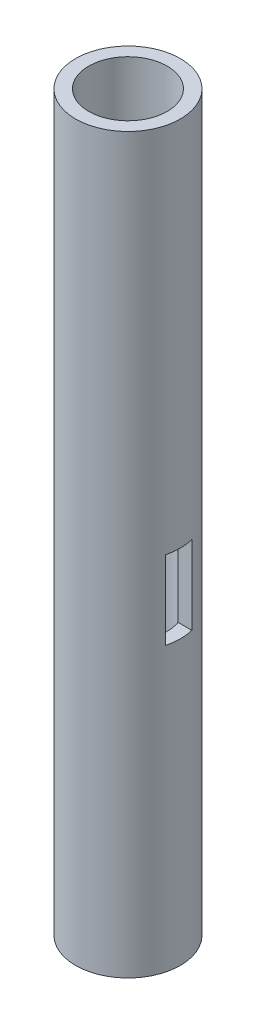
ISO-10303-21;
HEADER;
FILE_DESCRIPTION(('STEP AP214'),'2;1');
FILE_NAME('part.step','',(''),(''),'','','');
FILE_SCHEMA(('AUTOMOTIVE_DESIGN { 1 0 10303 214 1 1 1 1 }'));
ENDSEC;
DATA;
#1=APPLICATION_CONTEXT('core data for automotive mechanical design processes');
#2=APPLICATION_PROTOCOL_DEFINITION('international standard','automotive_design',2000,#1);
#3=PRODUCT_CONTEXT('',#1,'mechanical');
#4=PRODUCT('Part','Part','',(#3));
#5=PRODUCT_RELATED_PRODUCT_CATEGORY('part','',(#4));
#6=PRODUCT_DEFINITION_FORMATION('','',#4);
#7=PRODUCT_DEFINITION_CONTEXT('part definition',#1,'design');
#8=PRODUCT_DEFINITION('design','',#6,#7);
#9=PRODUCT_DEFINITION_SHAPE('','',#8);
#10=(LENGTH_UNIT() NAMED_UNIT(*) SI_UNIT(.MILLI.,.METRE.));
#11=(NAMED_UNIT(*) PLANE_ANGLE_UNIT() SI_UNIT($,.RADIAN.));
#12=(NAMED_UNIT(*) SI_UNIT($,.STERADIAN.) SOLID_ANGLE_UNIT());
#13=UNCERTAINTY_MEASURE_WITH_UNIT(LENGTH_MEASURE(1.E-05),#10,'distance_accuracy_value','');
#14=(GEOMETRIC_REPRESENTATION_CONTEXT(3) GLOBAL_UNCERTAINTY_ASSIGNED_CONTEXT((#13)) GLOBAL_UNIT_ASSIGNED_CONTEXT((#10,
#11,#12)) REPRESENTATION_CONTEXT('',''));
#15=CARTESIAN_POINT('',(0.,0.,0.));
#16=DIRECTION('',(0.,0.,1.));
#17=DIRECTION('',(1.,0.,0.));
#18=AXIS2_PLACEMENT_3D('',#15,#16,#17);
#19=CARTESIAN_POINT('',(0.,177.8,0.));
#20=DIRECTION('',(0.,1.,0.));
#21=DIRECTION('',(0.,0.,1.));
#22=AXIS2_PLACEMENT_3D('',#19,#20,#21);
#23=PLANE('',#22);
#24=CARTESIAN_POINT('',(0.,177.8,0.));
#25=DIRECTION('',(0.,1.,0.));
#26=DIRECTION('',(0.,0.,1.));
#27=AXIS2_PLACEMENT_3D('',#24,#25,#26);
#28=CIRCLE('',#27,12.7);
#29=CARTESIAN_POINT('',(0.,177.8,12.7));
#30=VERTEX_POINT('',#29);
#31=EDGE_CURVE('E119',#30,#30,#28,.T.);
#32=ORIENTED_EDGE('',*,*,#31,.T.);
#33=EDGE_LOOP('',(#32));
#34=FACE_BOUND('',#33,.T.);
#35=CARTESIAN_POINT('',(0.,177.8,0.));
#36=DIRECTION('',(0.,1.,0.));
#37=DIRECTION('',(0.,0.,1.));
#38=AXIS2_PLACEMENT_3D('',#35,#36,#37);
#39=CIRCLE('',#38,9.525);
#40=CARTESIAN_POINT('',(0.,177.8,9.525));
#41=VERTEX_POINT('',#40);
#42=EDGE_CURVE('E198',#41,#41,#39,.T.);
#43=ORIENTED_EDGE('',*,*,#42,.F.);
#44=EDGE_LOOP('',(#43));
#45=FACE_BOUND('',#44,.T.);
#46=ADVANCED_FACE('F40',(#34,#45),#23,.T.);
#47=CARTESIAN_POINT('',(0.,0.,0.));
#48=DIRECTION('',(0.,1.,0.));
#49=DIRECTION('',(0.,0.,1.));
#50=AXIS2_PLACEMENT_3D('',#47,#48,#49);
#51=PLANE('',#50);
#52=CARTESIAN_POINT('',(0.,0.,0.));
#53=DIRECTION('',(0.,1.,0.));
#54=DIRECTION('',(0.,0.,1.));
#55=AXIS2_PLACEMENT_3D('',#52,#53,#54);
#56=CIRCLE('',#55,12.7);
#57=CARTESIAN_POINT('',(0.,0.,12.7));
#58=VERTEX_POINT('',#57);
#59=EDGE_CURVE('E202',#58,#58,#56,.T.);
#60=ORIENTED_EDGE('',*,*,#59,.F.);
#61=EDGE_LOOP('',(#60));
#62=FACE_BOUND('',#61,.T.);
#63=CARTESIAN_POINT('',(0.,0.,0.));
#64=DIRECTION('',(0.,1.,0.));
#65=DIRECTION('',(0.,0.,1.));
#66=AXIS2_PLACEMENT_3D('',#63,#64,#65);
#67=CIRCLE('',#66,9.525);
#68=CARTESIAN_POINT('',(0.,0.,9.525));
#69=VERTEX_POINT('',#68);
#70=EDGE_CURVE('E197',#69,#69,#67,.T.);
#71=ORIENTED_EDGE('',*,*,#70,.T.);
#72=EDGE_LOOP('',(#71));
#73=FACE_BOUND('',#72,.T.);
#74=ADVANCED_FACE('F213',(#62,#73),#51,.F.);
#75=CARTESIAN_POINT('',(0.,177.8,0.));
#76=DIRECTION('',(0.,-1.,0.));
#77=DIRECTION('',(0.,0.,-1.));
#78=AXIS2_PLACEMENT_3D('',#75,#76,#77);
#79=CYLINDRICAL_SURFACE('',#78,12.7);
#80=DIRECTION('',(0.,-1.,0.));
#81=VECTOR('',#80,1.);
#82=CARTESIAN_POINT('',(-12.2967221242085,177.8,3.17500000000001));
#83=LINE('',#82,#81);
#84=CARTESIAN_POINT('',(-12.2967221242085,87.67064,3.17500000000001));
#85=VERTEX_POINT('',#84);
#86=CARTESIAN_POINT('',(-12.2967221242085,68.62064,3.17500000000001));
#87=VERTEX_POINT('',#86);
#88=EDGE_CURVE('E194',#85,#87,#83,.T.);
#89=ORIENTED_EDGE('',*,*,#88,.T.);
#90=CARTESIAN_POINT('',(0.,68.62064,0.));
#91=DIRECTION('',(0.,-1.,0.));
#92=DIRECTION('',(0.,0.,-1.));
#93=AXIS2_PLACEMENT_3D('',#90,#91,#92);
#94=CIRCLE('',#93,12.7);
#95=CARTESIAN_POINT('',(-12.2967221242086,68.62064,-3.17499999999999));
#96=VERTEX_POINT('',#95);
#97=EDGE_CURVE('E56',#87,#96,#94,.T.);
#98=ORIENTED_EDGE('',*,*,#97,.T.);
#99=DIRECTION('',(0.,-1.,0.));
#100=VECTOR('',#99,1.);
#101=CARTESIAN_POINT('',(-12.2967221242086,177.8,-3.17499999999999));
#102=LINE('',#101,#100);
#103=CARTESIAN_POINT('',(-12.2967221242086,87.67064,-3.17499999999999));
#104=VERTEX_POINT('',#103);
#105=EDGE_CURVE('E126',#96,#104,#102,.F.);
#106=ORIENTED_EDGE('',*,*,#105,.T.);
#107=CARTESIAN_POINT('',(0.,87.67064,0.));
#108=DIRECTION('',(0.,1.,0.));
#109=DIRECTION('',(0.,0.,1.));
#110=AXIS2_PLACEMENT_3D('',#107,#108,#109);
#111=CIRCLE('',#110,12.7);
#112=EDGE_CURVE('E188',#104,#85,#111,.T.);
#113=ORIENTED_EDGE('',*,*,#112,.T.);
#114=EDGE_LOOP('',(#89,#98,#106,#113));
#115=FACE_BOUND('',#114,.T.);
#116=DIRECTION('',(0.,-1.,0.));
#117=VECTOR('',#116,1.);
#118=CARTESIAN_POINT('',(12.2967221242086,177.8,-3.17499999999999));
#119=LINE('',#118,#117);
#120=CARTESIAN_POINT('',(12.2967221242086,87.67064,-3.17499999999999));
#121=VERTEX_POINT('',#120);
#122=CARTESIAN_POINT('',(12.2967221242086,68.62064,-3.17499999999999));
#123=VERTEX_POINT('',#122);
#124=EDGE_CURVE('E174',#121,#123,#119,.T.);
#125=ORIENTED_EDGE('',*,*,#124,.T.);
#126=CARTESIAN_POINT('',(12.2967221242085,68.62064,3.17500000000001));
#127=VERTEX_POINT('',#126);
#128=EDGE_CURVE('E64',#123,#127,#94,.T.);
#129=ORIENTED_EDGE('',*,*,#128,.T.);
#130=DIRECTION('',(0.,-1.,0.));
#131=VECTOR('',#130,1.);
#132=CARTESIAN_POINT('',(12.2967221242085,177.8,3.17500000000001));
#133=LINE('',#132,#131);
#134=CARTESIAN_POINT('',(12.2967221242085,87.67064,3.17500000000001));
#135=VERTEX_POINT('',#134);
#136=EDGE_CURVE('E164',#127,#135,#133,.F.);
#137=ORIENTED_EDGE('',*,*,#136,.T.);
#138=EDGE_CURVE('E189',#135,#121,#111,.T.);
#139=ORIENTED_EDGE('',*,*,#138,.T.);
#140=EDGE_LOOP('',(#125,#129,#137,#139));
#141=FACE_BOUND('',#140,.T.);
#142=ORIENTED_EDGE('',*,*,#31,.F.);
#143=EDGE_LOOP('',(#142));
#144=FACE_BOUND('',#143,.T.);
#145=ORIENTED_EDGE('',*,*,#59,.T.);
#146=EDGE_LOOP('',(#145));
#147=FACE_BOUND('',#146,.T.);
#148=ADVANCED_FACE('F42',(#115,#141,#144,#147),#79,.T.);
#149=CARTESIAN_POINT('',(0.,177.8,0.));
#150=DIRECTION('',(0.,-1.,0.));
#151=DIRECTION('',(0.,0.,-1.));
#152=AXIS2_PLACEMENT_3D('',#149,#150,#151);
#153=CYLINDRICAL_SURFACE('',#152,9.525);
#154=DIRECTION('',(0.,-1.,0.));
#155=VECTOR('',#154,1.);
#156=CARTESIAN_POINT('',(8.98025612106915,177.8,3.17500000000001));
#157=LINE('',#156,#155);
#158=CARTESIAN_POINT('',(8.98025612106915,68.62064,3.17500000000001));
#159=VERTEX_POINT('',#158);
#160=CARTESIAN_POINT('',(8.98025612106915,87.67064,3.17500000000001));
#161=VERTEX_POINT('',#160);
#162=EDGE_CURVE('E11',#159,#161,#157,.F.);
#163=ORIENTED_EDGE('',*,*,#162,.F.);
#164=CARTESIAN_POINT('',(0.,68.62064,0.));
#165=DIRECTION('',(0.,-1.,0.));
#166=DIRECTION('',(0.,0.,-1.));
#167=AXIS2_PLACEMENT_3D('',#164,#165,#166);
#168=CIRCLE('',#167,9.525);
#169=CARTESIAN_POINT('',(8.98025612106916,68.62064,-3.17499999999999));
#170=VERTEX_POINT('',#169);
#171=EDGE_CURVE('E121',#170,#159,#168,.T.);
#172=ORIENTED_EDGE('',*,*,#171,.F.);
#173=DIRECTION('',(0.,-1.,0.));
#174=VECTOR('',#173,1.);
#175=CARTESIAN_POINT('',(8.98025612106916,177.8,-3.17499999999999));
#176=LINE('',#175,#174);
#177=CARTESIAN_POINT('',(8.98025612106916,87.67064,-3.17499999999999));
#178=VERTEX_POINT('',#177);
#179=EDGE_CURVE('E143',#178,#170,#176,.T.);
#180=ORIENTED_EDGE('',*,*,#179,.F.);
#181=CARTESIAN_POINT('',(0.,87.67064,0.));
#182=DIRECTION('',(0.,1.,0.));
#183=DIRECTION('',(0.,0.,1.));
#184=AXIS2_PLACEMENT_3D('',#181,#182,#183);
#185=CIRCLE('',#184,9.525);
#186=EDGE_CURVE('E49',#161,#178,#185,.T.);
#187=ORIENTED_EDGE('',*,*,#186,.F.);
#188=EDGE_LOOP('',(#163,#172,#180,#187));
#189=FACE_BOUND('',#188,.T.);
#190=DIRECTION('',(0.,-1.,0.));
#191=VECTOR('',#190,1.);
#192=CARTESIAN_POINT('',(-8.98025612106915,177.8,3.17500000000001));
#193=LINE('',#192,#191);
#194=CARTESIAN_POINT('',(-8.98025612106915,87.67064,3.17500000000001));
#195=VERTEX_POINT('',#194);
#196=CARTESIAN_POINT('',(-8.98025612106915,68.62064,3.17500000000001));
#197=VERTEX_POINT('',#196);
#198=EDGE_CURVE('E138',#195,#197,#193,.T.);
#199=ORIENTED_EDGE('',*,*,#198,.F.);
#200=CARTESIAN_POINT('',(-8.98025612106916,87.67064,-3.17499999999999));
#201=VERTEX_POINT('',#200);
#202=EDGE_CURVE('E134',#201,#195,#185,.T.);
#203=ORIENTED_EDGE('',*,*,#202,.F.);
#204=DIRECTION('',(0.,-1.,0.));
#205=VECTOR('',#204,1.);
#206=CARTESIAN_POINT('',(-8.98025612106916,177.8,-3.17499999999999));
#207=LINE('',#206,#205);
#208=CARTESIAN_POINT('',(-8.98025612106916,68.62064,-3.17499999999999));
#209=VERTEX_POINT('',#208);
#210=EDGE_CURVE('E118',#209,#201,#207,.F.);
#211=ORIENTED_EDGE('',*,*,#210,.F.);
#212=EDGE_CURVE('E106',#197,#209,#168,.T.);
#213=ORIENTED_EDGE('',*,*,#212,.F.);
#214=EDGE_LOOP('',(#199,#203,#211,#213));
#215=FACE_BOUND('',#214,.T.);
#216=ORIENTED_EDGE('',*,*,#42,.T.);
#217=EDGE_LOOP('',(#216));
#218=FACE_BOUND('',#217,.T.);
#219=ORIENTED_EDGE('',*,*,#70,.F.);
#220=EDGE_LOOP('',(#219));
#221=FACE_BOUND('',#220,.T.);
#222=ADVANCED_FACE('F132',(#189,#215,#218,#221),#153,.F.);
#223=CARTESIAN_POINT('',(-12.7,68.62064,3.17500000000001));
#224=DIRECTION('',(0.,-1.,0.));
#225=DIRECTION('',(0.,0.,-1.));
#226=AXIS2_PLACEMENT_3D('',#223,#224,#225);
#227=PLANE('',#226);
#228=DIRECTION('',(1.,0.,0.));
#229=VECTOR('',#228,1.);
#230=CARTESIAN_POINT('',(-12.7,68.62064,3.17500000000001));
#231=LINE('',#230,#229);
#232=EDGE_CURVE('E112',#87,#197,#231,.T.);
#233=ORIENTED_EDGE('',*,*,#232,.T.);
#234=ORIENTED_EDGE('',*,*,#212,.T.);
#235=DIRECTION('',(1.,0.,0.));
#236=VECTOR('',#235,1.);
#237=CARTESIAN_POINT('',(-12.7,68.62064,-3.17499999999999));
#238=LINE('',#237,#236);
#239=EDGE_CURVE('E109',#96,#209,#238,.T.);
#240=ORIENTED_EDGE('',*,*,#239,.F.);
#241=ORIENTED_EDGE('',*,*,#97,.F.);
#242=EDGE_LOOP('',(#233,#234,#240,#241));
#243=FACE_BOUND('',#242,.T.);
#244=ADVANCED_FACE('F108',(#243),#227,.F.);
#245=CARTESIAN_POINT('',(-12.7,68.62064,-3.17499999999999));
#246=DIRECTION('',(0.,0.,-1.));
#247=DIRECTION('',(-1.,0.,0.));
#248=AXIS2_PLACEMENT_3D('',#245,#246,#247);
#249=PLANE('',#248);
#250=ORIENTED_EDGE('',*,*,#239,.T.);
#251=ORIENTED_EDGE('',*,*,#210,.T.);
#252=DIRECTION('',(1.,0.,0.));
#253=VECTOR('',#252,1.);
#254=CARTESIAN_POINT('',(-12.7,87.67064,-3.17499999999999));
#255=LINE('',#254,#253);
#256=EDGE_CURVE('E176',#104,#201,#255,.T.);
#257=ORIENTED_EDGE('',*,*,#256,.F.);
#258=ORIENTED_EDGE('',*,*,#105,.F.);
#259=EDGE_LOOP('',(#250,#251,#257,#258));
#260=FACE_BOUND('',#259,.T.);
#261=ADVANCED_FACE('F123',(#260),#249,.F.);
#262=CARTESIAN_POINT('',(-12.7,87.67064,3.17500000000001));
#263=DIRECTION('',(0.,1.,0.));
#264=DIRECTION('',(0.,0.,1.));
#265=AXIS2_PLACEMENT_3D('',#262,#263,#264);
#266=PLANE('',#265);
#267=ORIENTED_EDGE('',*,*,#256,.T.);
#268=ORIENTED_EDGE('',*,*,#202,.T.);
#269=DIRECTION('',(1.,0.,0.));
#270=VECTOR('',#269,1.);
#271=CARTESIAN_POINT('',(-12.7,87.67064,3.17500000000001));
#272=LINE('',#271,#270);
#273=EDGE_CURVE('E319',#85,#195,#272,.T.);
#274=ORIENTED_EDGE('',*,*,#273,.F.);
#275=ORIENTED_EDGE('',*,*,#112,.F.);
#276=EDGE_LOOP('',(#267,#268,#274,#275));
#277=FACE_BOUND('',#276,.T.);
#278=ADVANCED_FACE('F263',(#277),#266,.F.);
#279=CARTESIAN_POINT('',(-12.7,68.62064,3.17500000000001));
#280=DIRECTION('',(0.,0.,1.));
#281=DIRECTION('',(1.,0.,0.));
#282=AXIS2_PLACEMENT_3D('',#279,#280,#281);
#283=PLANE('',#282);
#284=ORIENTED_EDGE('',*,*,#273,.T.);
#285=ORIENTED_EDGE('',*,*,#198,.T.);
#286=ORIENTED_EDGE('',*,*,#232,.F.);
#287=ORIENTED_EDGE('',*,*,#88,.F.);
#288=EDGE_LOOP('',(#284,#285,#286,#287));
#289=FACE_BOUND('',#288,.T.);
#290=ADVANCED_FACE('F270',(#289),#283,.F.);
#291=EDGE_CURVE('E156',#159,#127,#231,.T.);
#292=ORIENTED_EDGE('',*,*,#291,.F.);
#293=ORIENTED_EDGE('',*,*,#162,.T.);
#294=EDGE_CURVE('E171',#161,#135,#272,.T.);
#295=ORIENTED_EDGE('',*,*,#294,.T.);
#296=ORIENTED_EDGE('',*,*,#136,.F.);
#297=EDGE_LOOP('',(#292,#293,#295,#296));
#298=FACE_BOUND('',#297,.T.);
#299=ADVANCED_FACE('F161',(#298),#283,.F.);
#300=ORIENTED_EDGE('',*,*,#294,.F.);
#301=ORIENTED_EDGE('',*,*,#186,.T.);
#302=EDGE_CURVE('E128',#178,#121,#255,.T.);
#303=ORIENTED_EDGE('',*,*,#302,.T.);
#304=ORIENTED_EDGE('',*,*,#138,.F.);
#305=EDGE_LOOP('',(#300,#301,#303,#304));
#306=FACE_BOUND('',#305,.T.);
#307=ADVANCED_FACE('F170',(#306),#266,.F.);
#308=ORIENTED_EDGE('',*,*,#302,.F.);
#309=ORIENTED_EDGE('',*,*,#179,.T.);
#310=EDGE_CURVE('E129',#170,#123,#238,.T.);
#311=ORIENTED_EDGE('',*,*,#310,.T.);
#312=ORIENTED_EDGE('',*,*,#124,.F.);
#313=EDGE_LOOP('',(#308,#309,#311,#312));
#314=FACE_BOUND('',#313,.T.);
#315=ADVANCED_FACE('F173',(#314),#249,.F.);
#316=ORIENTED_EDGE('',*,*,#310,.F.);
#317=ORIENTED_EDGE('',*,*,#171,.T.);
#318=ORIENTED_EDGE('',*,*,#291,.T.);
#319=ORIENTED_EDGE('',*,*,#128,.F.);
#320=EDGE_LOOP('',(#316,#317,#318,#319));
#321=FACE_BOUND('',#320,.T.);
#322=ADVANCED_FACE('F155',(#321),#227,.F.);
#323=CLOSED_SHELL('',(#46,#74,#148,#222,#244,#261,#278,#290,#299,#307,#315,#322));
#324=MANIFOLD_SOLID_BREP('B2',#323);
#325=ADVANCED_BREP_SHAPE_REPRESENTATION('',(#18,#324),#14);
#326=SHAPE_DEFINITION_REPRESENTATION(#9,#325);
ENDSEC;
END-ISO-10303-21;
